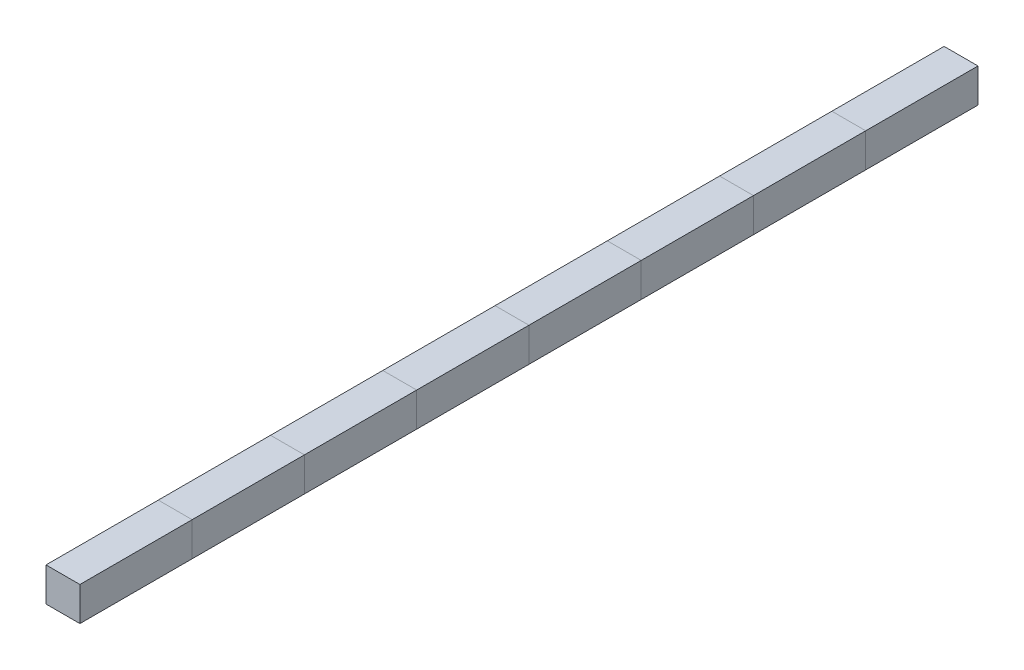
ISO-10303-21;
HEADER;
FILE_DESCRIPTION(('STEP AP214'),'2;1');
FILE_NAME('part.step','',(''),(''),'','','');
FILE_SCHEMA(('AUTOMOTIVE_DESIGN { 1 0 10303 214 1 1 1 1 }'));
ENDSEC;
DATA;
#1=APPLICATION_CONTEXT('core data for automotive mechanical design processes');
#2=APPLICATION_PROTOCOL_DEFINITION('international standard','automotive_design',2000,#1);
#3=PRODUCT_CONTEXT('',#1,'mechanical');
#4=PRODUCT('Part','Part','',(#3));
#5=PRODUCT_RELATED_PRODUCT_CATEGORY('part','',(#4));
#6=PRODUCT_DEFINITION_FORMATION('','',#4);
#7=PRODUCT_DEFINITION_CONTEXT('part definition',#1,'design');
#8=PRODUCT_DEFINITION('design','',#6,#7);
#9=PRODUCT_DEFINITION_SHAPE('','',#8);
#10=(LENGTH_UNIT() NAMED_UNIT(*) SI_UNIT(.MILLI.,.METRE.));
#11=(NAMED_UNIT(*) PLANE_ANGLE_UNIT() SI_UNIT($,.RADIAN.));
#12=(NAMED_UNIT(*) SI_UNIT($,.STERADIAN.) SOLID_ANGLE_UNIT());
#13=UNCERTAINTY_MEASURE_WITH_UNIT(LENGTH_MEASURE(1.E-05),#10,'distance_accuracy_value','');
#14=(GEOMETRIC_REPRESENTATION_CONTEXT(3) GLOBAL_UNCERTAINTY_ASSIGNED_CONTEXT((#13)) GLOBAL_UNIT_ASSIGNED_CONTEXT((#10,
#11,#12)) REPRESENTATION_CONTEXT('',''));
#15=CARTESIAN_POINT('',(0.,0.,0.));
#16=DIRECTION('',(0.,0.,1.));
#17=DIRECTION('',(1.,0.,0.));
#18=AXIS2_PLACEMENT_3D('',#15,#16,#17);
#19=CARTESIAN_POINT('',(10.,-10.,-397.5));
#20=DIRECTION('',(-1.,0.,0.));
#21=DIRECTION('',(0.,0.,1.));
#22=AXIS2_PLACEMENT_3D('',#19,#20,#21);
#23=PLANE('',#22);
#24=DIRECTION('',(0.,1.,0.));
#25=VECTOR('',#24,1.);
#26=CARTESIAN_POINT('',(10.,-10.,-463.75));
#27=LINE('',#26,#25);
#28=CARTESIAN_POINT('',(10.,-10.,-463.75));
#29=VERTEX_POINT('',#28);
#30=CARTESIAN_POINT('',(10.,10.,-463.75));
#31=VERTEX_POINT('',#30);
#32=EDGE_CURVE('E109',#29,#31,#27,.T.);
#33=ORIENTED_EDGE('',*,*,#32,.T.);
#34=DIRECTION('',(0.,0.,-1.));
#35=VECTOR('',#34,1.);
#36=CARTESIAN_POINT('',(10.,10.,-397.5));
#37=LINE('',#36,#35);
#38=CARTESIAN_POINT('',(10.,10.,-397.5));
#39=VERTEX_POINT('',#38);
#40=EDGE_CURVE('E12',#39,#31,#37,.T.);
#41=ORIENTED_EDGE('',*,*,#40,.F.);
#42=DIRECTION('',(0.,1.,0.));
#43=VECTOR('',#42,1.);
#44=CARTESIAN_POINT('',(10.,-10.,-397.5));
#45=LINE('',#44,#43);
#46=CARTESIAN_POINT('',(10.,-10.,-397.5));
#47=VERTEX_POINT('',#46);
#48=EDGE_CURVE('E97',#47,#39,#45,.T.);
#49=ORIENTED_EDGE('',*,*,#48,.F.);
#50=DIRECTION('',(0.,0.,-1.));
#51=VECTOR('',#50,1.);
#52=CARTESIAN_POINT('',(10.,-10.,-397.5));
#53=LINE('',#52,#51);
#54=EDGE_CURVE('E105',#47,#29,#53,.T.);
#55=ORIENTED_EDGE('',*,*,#54,.T.);
#56=EDGE_LOOP('',(#33,#41,#49,#55));
#57=FACE_BOUND('',#56,.T.);
#58=ADVANCED_FACE('F46',(#57),#23,.F.);
#59=CARTESIAN_POINT('',(-10.,10.,-397.5));
#60=DIRECTION('',(0.,-1.,0.));
#61=DIRECTION('',(0.,0.,-1.));
#62=AXIS2_PLACEMENT_3D('',#59,#60,#61);
#63=PLANE('',#62);
#64=DIRECTION('',(-1.,0.,0.));
#65=VECTOR('',#64,1.);
#66=CARTESIAN_POINT('',(-10.,10.,-463.75));
#67=LINE('',#66,#65);
#68=CARTESIAN_POINT('',(-10.,10.,-463.75));
#69=VERTEX_POINT('',#68);
#70=EDGE_CURVE('E101',#31,#69,#67,.T.);
#71=ORIENTED_EDGE('',*,*,#70,.T.);
#72=DIRECTION('',(0.,0.,-1.));
#73=VECTOR('',#72,1.);
#74=CARTESIAN_POINT('',(-10.,10.,-397.5));
#75=LINE('',#74,#73);
#76=CARTESIAN_POINT('',(-10.,10.,-397.5));
#77=VERTEX_POINT('',#76);
#78=EDGE_CURVE('E54',#77,#69,#75,.T.);
#79=ORIENTED_EDGE('',*,*,#78,.F.);
#80=DIRECTION('',(-1.,0.,0.));
#81=VECTOR('',#80,1.);
#82=CARTESIAN_POINT('',(-10.,10.,-397.5));
#83=LINE('',#82,#81);
#84=EDGE_CURVE('E92',#39,#77,#83,.T.);
#85=ORIENTED_EDGE('',*,*,#84,.F.);
#86=ORIENTED_EDGE('',*,*,#40,.T.);
#87=EDGE_LOOP('',(#71,#79,#85,#86));
#88=FACE_BOUND('',#87,.T.);
#89=ADVANCED_FACE('F100',(#88),#63,.F.);
#90=CARTESIAN_POINT('',(-10.,-10.,-397.5));
#91=DIRECTION('',(1.,0.,0.));
#92=DIRECTION('',(0.,0.,-1.));
#93=AXIS2_PLACEMENT_3D('',#90,#91,#92);
#94=PLANE('',#93);
#95=DIRECTION('',(0.,-1.,0.));
#96=VECTOR('',#95,1.);
#97=CARTESIAN_POINT('',(-10.,-10.,-463.75));
#98=LINE('',#97,#96);
#99=CARTESIAN_POINT('',(-10.,-10.,-463.75));
#100=VERTEX_POINT('',#99);
#101=EDGE_CURVE('E79',#69,#100,#98,.T.);
#102=ORIENTED_EDGE('',*,*,#101,.T.);
#103=DIRECTION('',(0.,0.,-1.));
#104=VECTOR('',#103,1.);
#105=CARTESIAN_POINT('',(-10.,-10.,-397.5));
#106=LINE('',#105,#104);
#107=CARTESIAN_POINT('',(-10.,-10.,-397.5));
#108=VERTEX_POINT('',#107);
#109=EDGE_CURVE('E102',#108,#100,#106,.T.);
#110=ORIENTED_EDGE('',*,*,#109,.F.);
#111=DIRECTION('',(0.,-1.,0.));
#112=VECTOR('',#111,1.);
#113=CARTESIAN_POINT('',(-10.,-10.,-397.5));
#114=LINE('',#113,#112);
#115=EDGE_CURVE('E95',#77,#108,#114,.T.);
#116=ORIENTED_EDGE('',*,*,#115,.F.);
#117=ORIENTED_EDGE('',*,*,#78,.T.);
#118=EDGE_LOOP('',(#102,#110,#116,#117));
#119=FACE_BOUND('',#118,.T.);
#120=ADVANCED_FACE('F103',(#119),#94,.F.);
#121=CARTESIAN_POINT('',(-10.,-10.,-397.5));
#122=DIRECTION('',(0.,1.,0.));
#123=DIRECTION('',(0.,0.,1.));
#124=AXIS2_PLACEMENT_3D('',#121,#122,#123);
#125=PLANE('',#124);
#126=DIRECTION('',(1.,0.,0.));
#127=VECTOR('',#126,1.);
#128=CARTESIAN_POINT('',(-10.,-10.,-463.75));
#129=LINE('',#128,#127);
#130=EDGE_CURVE('E85',#100,#29,#129,.T.);
#131=ORIENTED_EDGE('',*,*,#130,.T.);
#132=ORIENTED_EDGE('',*,*,#54,.F.);
#133=DIRECTION('',(1.,0.,0.));
#134=VECTOR('',#133,1.);
#135=CARTESIAN_POINT('',(-10.,-10.,-397.5));
#136=LINE('',#135,#134);
#137=EDGE_CURVE('E62',#108,#47,#136,.T.);
#138=ORIENTED_EDGE('',*,*,#137,.F.);
#139=ORIENTED_EDGE('',*,*,#109,.T.);
#140=EDGE_LOOP('',(#131,#132,#138,#139));
#141=FACE_BOUND('',#140,.T.);
#142=ADVANCED_FACE('F116',(#141),#125,.F.);
#143=CARTESIAN_POINT('',(0.,0.,-397.5));
#144=DIRECTION('',(0.,0.,-1.));
#145=DIRECTION('',(-1.,0.,0.));
#146=AXIS2_PLACEMENT_3D('',#143,#144,#145);
#147=PLANE('',#146);
#148=ORIENTED_EDGE('',*,*,#48,.T.);
#149=ORIENTED_EDGE('',*,*,#84,.T.);
#150=ORIENTED_EDGE('',*,*,#115,.T.);
#151=ORIENTED_EDGE('',*,*,#137,.T.);
#152=EDGE_LOOP('',(#148,#149,#150,#151));
#153=FACE_BOUND('',#152,.T.);
#154=ADVANCED_FACE('F93',(#153),#147,.F.);
#155=CARTESIAN_POINT('',(0.,0.,-463.75));
#156=DIRECTION('',(0.,0.,-1.));
#157=DIRECTION('',(-1.,0.,0.));
#158=AXIS2_PLACEMENT_3D('',#155,#156,#157);
#159=PLANE('',#158);
#160=ORIENTED_EDGE('',*,*,#32,.F.);
#161=ORIENTED_EDGE('',*,*,#130,.F.);
#162=ORIENTED_EDGE('',*,*,#101,.F.);
#163=ORIENTED_EDGE('',*,*,#70,.F.);
#164=EDGE_LOOP('',(#160,#161,#162,#163));
#165=FACE_BOUND('',#164,.T.);
#166=ADVANCED_FACE('F119',(#165),#159,.T.);
#167=CLOSED_SHELL('',(#58,#89,#120,#142,#154,#166));
#168=MANIFOLD_SOLID_BREP('B2',#167);
#169=CARTESIAN_POINT('',(10.,-10.,-331.25));
#170=DIRECTION('',(-1.,0.,0.));
#171=DIRECTION('',(0.,0.,1.));
#172=AXIS2_PLACEMENT_3D('',#169,#170,#171);
#173=PLANE('',#172);
#174=DIRECTION('',(0.,1.,0.));
#175=VECTOR('',#174,1.);
#176=CARTESIAN_POINT('',(10.,-10.,-397.5));
#177=LINE('',#176,#175);
#178=CARTESIAN_POINT('',(10.,-10.,-397.5));
#179=VERTEX_POINT('',#178);
#180=CARTESIAN_POINT('',(10.,10.,-397.5));
#181=VERTEX_POINT('',#180);
#182=EDGE_CURVE('E255',#179,#181,#177,.T.);
#183=ORIENTED_EDGE('',*,*,#182,.T.);
#184=DIRECTION('',(0.,0.,-1.));
#185=VECTOR('',#184,1.);
#186=CARTESIAN_POINT('',(10.,10.,-331.25));
#187=LINE('',#186,#185);
#188=CARTESIAN_POINT('',(10.,10.,-331.25));
#189=VERTEX_POINT('',#188);
#190=EDGE_CURVE('E44',#189,#181,#187,.T.);
#191=ORIENTED_EDGE('',*,*,#190,.F.);
#192=DIRECTION('',(0.,1.,0.));
#193=VECTOR('',#192,1.);
#194=CARTESIAN_POINT('',(10.,-10.,-331.25));
#195=LINE('',#194,#193);
#196=CARTESIAN_POINT('',(10.,-10.,-331.25));
#197=VERTEX_POINT('',#196);
#198=EDGE_CURVE('E243',#197,#189,#195,.T.);
#199=ORIENTED_EDGE('',*,*,#198,.F.);
#200=DIRECTION('',(0.,0.,-1.));
#201=VECTOR('',#200,1.);
#202=CARTESIAN_POINT('',(10.,-10.,-331.25));
#203=LINE('',#202,#201);
#204=EDGE_CURVE('E251',#197,#179,#203,.T.);
#205=ORIENTED_EDGE('',*,*,#204,.T.);
#206=EDGE_LOOP('',(#183,#191,#199,#205));
#207=FACE_BOUND('',#206,.T.);
#208=ADVANCED_FACE('F192',(#207),#173,.F.);
#209=CARTESIAN_POINT('',(-10.,10.,-331.25));
#210=DIRECTION('',(0.,-1.,0.));
#211=DIRECTION('',(0.,0.,-1.));
#212=AXIS2_PLACEMENT_3D('',#209,#210,#211);
#213=PLANE('',#212);
#214=DIRECTION('',(-1.,0.,0.));
#215=VECTOR('',#214,1.);
#216=CARTESIAN_POINT('',(-10.,10.,-397.5));
#217=LINE('',#216,#215);
#218=CARTESIAN_POINT('',(-10.,10.,-397.5));
#219=VERTEX_POINT('',#218);
#220=EDGE_CURVE('E247',#181,#219,#217,.T.);
#221=ORIENTED_EDGE('',*,*,#220,.T.);
#222=DIRECTION('',(0.,0.,-1.));
#223=VECTOR('',#222,1.);
#224=CARTESIAN_POINT('',(-10.,10.,-331.25));
#225=LINE('',#224,#223);
#226=CARTESIAN_POINT('',(-10.,10.,-331.25));
#227=VERTEX_POINT('',#226);
#228=EDGE_CURVE('E200',#227,#219,#225,.T.);
#229=ORIENTED_EDGE('',*,*,#228,.F.);
#230=DIRECTION('',(-1.,0.,0.));
#231=VECTOR('',#230,1.);
#232=CARTESIAN_POINT('',(-10.,10.,-331.25));
#233=LINE('',#232,#231);
#234=EDGE_CURVE('E238',#189,#227,#233,.T.);
#235=ORIENTED_EDGE('',*,*,#234,.F.);
#236=ORIENTED_EDGE('',*,*,#190,.T.);
#237=EDGE_LOOP('',(#221,#229,#235,#236));
#238=FACE_BOUND('',#237,.T.);
#239=ADVANCED_FACE('F246',(#238),#213,.F.);
#240=CARTESIAN_POINT('',(-10.,-10.,-331.25));
#241=DIRECTION('',(1.,0.,0.));
#242=DIRECTION('',(0.,0.,-1.));
#243=AXIS2_PLACEMENT_3D('',#240,#241,#242);
#244=PLANE('',#243);
#245=DIRECTION('',(0.,-1.,0.));
#246=VECTOR('',#245,1.);
#247=CARTESIAN_POINT('',(-10.,-10.,-397.5));
#248=LINE('',#247,#246);
#249=CARTESIAN_POINT('',(-10.,-10.,-397.5));
#250=VERTEX_POINT('',#249);
#251=EDGE_CURVE('E225',#219,#250,#248,.T.);
#252=ORIENTED_EDGE('',*,*,#251,.T.);
#253=DIRECTION('',(0.,0.,-1.));
#254=VECTOR('',#253,1.);
#255=CARTESIAN_POINT('',(-10.,-10.,-331.25));
#256=LINE('',#255,#254);
#257=CARTESIAN_POINT('',(-10.,-10.,-331.25));
#258=VERTEX_POINT('',#257);
#259=EDGE_CURVE('E248',#258,#250,#256,.T.);
#260=ORIENTED_EDGE('',*,*,#259,.F.);
#261=DIRECTION('',(0.,-1.,0.));
#262=VECTOR('',#261,1.);
#263=CARTESIAN_POINT('',(-10.,-10.,-331.25));
#264=LINE('',#263,#262);
#265=EDGE_CURVE('E241',#227,#258,#264,.T.);
#266=ORIENTED_EDGE('',*,*,#265,.F.);
#267=ORIENTED_EDGE('',*,*,#228,.T.);
#268=EDGE_LOOP('',(#252,#260,#266,#267));
#269=FACE_BOUND('',#268,.T.);
#270=ADVANCED_FACE('F249',(#269),#244,.F.);
#271=CARTESIAN_POINT('',(-10.,-10.,-331.25));
#272=DIRECTION('',(0.,1.,0.));
#273=DIRECTION('',(0.,0.,1.));
#274=AXIS2_PLACEMENT_3D('',#271,#272,#273);
#275=PLANE('',#274);
#276=DIRECTION('',(1.,0.,0.));
#277=VECTOR('',#276,1.);
#278=CARTESIAN_POINT('',(-10.,-10.,-397.5));
#279=LINE('',#278,#277);
#280=EDGE_CURVE('E231',#250,#179,#279,.T.);
#281=ORIENTED_EDGE('',*,*,#280,.T.);
#282=ORIENTED_EDGE('',*,*,#204,.F.);
#283=DIRECTION('',(1.,0.,0.));
#284=VECTOR('',#283,1.);
#285=CARTESIAN_POINT('',(-10.,-10.,-331.25));
#286=LINE('',#285,#284);
#287=EDGE_CURVE('E208',#258,#197,#286,.T.);
#288=ORIENTED_EDGE('',*,*,#287,.F.);
#289=ORIENTED_EDGE('',*,*,#259,.T.);
#290=EDGE_LOOP('',(#281,#282,#288,#289));
#291=FACE_BOUND('',#290,.T.);
#292=ADVANCED_FACE('F262',(#291),#275,.F.);
#293=CARTESIAN_POINT('',(0.,0.,-331.25));
#294=DIRECTION('',(0.,0.,-1.));
#295=DIRECTION('',(-1.,0.,0.));
#296=AXIS2_PLACEMENT_3D('',#293,#294,#295);
#297=PLANE('',#296);
#298=ORIENTED_EDGE('',*,*,#198,.T.);
#299=ORIENTED_EDGE('',*,*,#234,.T.);
#300=ORIENTED_EDGE('',*,*,#265,.T.);
#301=ORIENTED_EDGE('',*,*,#287,.T.);
#302=EDGE_LOOP('',(#298,#299,#300,#301));
#303=FACE_BOUND('',#302,.T.);
#304=ADVANCED_FACE('F239',(#303),#297,.F.);
#305=CARTESIAN_POINT('',(0.,0.,-397.5));
#306=DIRECTION('',(0.,0.,-1.));
#307=DIRECTION('',(-1.,0.,0.));
#308=AXIS2_PLACEMENT_3D('',#305,#306,#307);
#309=PLANE('',#308);
#310=ORIENTED_EDGE('',*,*,#182,.F.);
#311=ORIENTED_EDGE('',*,*,#280,.F.);
#312=ORIENTED_EDGE('',*,*,#251,.F.);
#313=ORIENTED_EDGE('',*,*,#220,.F.);
#314=EDGE_LOOP('',(#310,#311,#312,#313));
#315=FACE_BOUND('',#314,.T.);
#316=ADVANCED_FACE('F265',(#315),#309,.T.);
#317=CLOSED_SHELL('',(#208,#239,#270,#292,#304,#316));
#318=MANIFOLD_SOLID_BREP('B6',#317);
#319=CARTESIAN_POINT('',(10.,-10.,-265.));
#320=DIRECTION('',(-1.,0.,0.));
#321=DIRECTION('',(0.,0.,1.));
#322=AXIS2_PLACEMENT_3D('',#319,#320,#321);
#323=PLANE('',#322);
#324=DIRECTION('',(0.,1.,0.));
#325=VECTOR('',#324,1.);
#326=CARTESIAN_POINT('',(10.,-10.,-331.25));
#327=LINE('',#326,#325);
#328=CARTESIAN_POINT('',(10.,-10.,-331.25));
#329=VERTEX_POINT('',#328);
#330=CARTESIAN_POINT('',(10.,10.,-331.25));
#331=VERTEX_POINT('',#330);
#332=EDGE_CURVE('E399',#329,#331,#327,.T.);
#333=ORIENTED_EDGE('',*,*,#332,.T.);
#334=DIRECTION('',(0.,0.,-1.));
#335=VECTOR('',#334,1.);
#336=CARTESIAN_POINT('',(10.,10.,-265.));
#337=LINE('',#336,#335);
#338=CARTESIAN_POINT('',(10.,10.,-265.));
#339=VERTEX_POINT('',#338);
#340=EDGE_CURVE('E190',#339,#331,#337,.T.);
#341=ORIENTED_EDGE('',*,*,#340,.F.);
#342=DIRECTION('',(0.,1.,0.));
#343=VECTOR('',#342,1.);
#344=CARTESIAN_POINT('',(10.,-10.,-265.));
#345=LINE('',#344,#343);
#346=CARTESIAN_POINT('',(10.,-10.,-265.));
#347=VERTEX_POINT('',#346);
#348=EDGE_CURVE('E387',#347,#339,#345,.T.);
#349=ORIENTED_EDGE('',*,*,#348,.F.);
#350=DIRECTION('',(0.,0.,-1.));
#351=VECTOR('',#350,1.);
#352=CARTESIAN_POINT('',(10.,-10.,-265.));
#353=LINE('',#352,#351);
#354=EDGE_CURVE('E395',#347,#329,#353,.T.);
#355=ORIENTED_EDGE('',*,*,#354,.T.);
#356=EDGE_LOOP('',(#333,#341,#349,#355));
#357=FACE_BOUND('',#356,.T.);
#358=ADVANCED_FACE('F336',(#357),#323,.F.);
#359=CARTESIAN_POINT('',(-10.,10.,-265.));
#360=DIRECTION('',(0.,-1.,0.));
#361=DIRECTION('',(0.,0.,-1.));
#362=AXIS2_PLACEMENT_3D('',#359,#360,#361);
#363=PLANE('',#362);
#364=DIRECTION('',(-1.,0.,0.));
#365=VECTOR('',#364,1.);
#366=CARTESIAN_POINT('',(-10.,10.,-331.25));
#367=LINE('',#366,#365);
#368=CARTESIAN_POINT('',(-10.,10.,-331.25));
#369=VERTEX_POINT('',#368);
#370=EDGE_CURVE('E391',#331,#369,#367,.T.);
#371=ORIENTED_EDGE('',*,*,#370,.T.);
#372=DIRECTION('',(0.,0.,-1.));
#373=VECTOR('',#372,1.);
#374=CARTESIAN_POINT('',(-10.,10.,-265.));
#375=LINE('',#374,#373);
#376=CARTESIAN_POINT('',(-10.,10.,-265.));
#377=VERTEX_POINT('',#376);
#378=EDGE_CURVE('E344',#377,#369,#375,.T.);
#379=ORIENTED_EDGE('',*,*,#378,.F.);
#380=DIRECTION('',(-1.,0.,0.));
#381=VECTOR('',#380,1.);
#382=CARTESIAN_POINT('',(-10.,10.,-265.));
#383=LINE('',#382,#381);
#384=EDGE_CURVE('E382',#339,#377,#383,.T.);
#385=ORIENTED_EDGE('',*,*,#384,.F.);
#386=ORIENTED_EDGE('',*,*,#340,.T.);
#387=EDGE_LOOP('',(#371,#379,#385,#386));
#388=FACE_BOUND('',#387,.T.);
#389=ADVANCED_FACE('F390',(#388),#363,.F.);
#390=CARTESIAN_POINT('',(-10.,-10.,-265.));
#391=DIRECTION('',(1.,0.,0.));
#392=DIRECTION('',(0.,0.,-1.));
#393=AXIS2_PLACEMENT_3D('',#390,#391,#392);
#394=PLANE('',#393);
#395=DIRECTION('',(0.,-1.,0.));
#396=VECTOR('',#395,1.);
#397=CARTESIAN_POINT('',(-10.,-10.,-331.25));
#398=LINE('',#397,#396);
#399=CARTESIAN_POINT('',(-10.,-10.,-331.25));
#400=VERTEX_POINT('',#399);
#401=EDGE_CURVE('E369',#369,#400,#398,.T.);
#402=ORIENTED_EDGE('',*,*,#401,.T.);
#403=DIRECTION('',(0.,0.,-1.));
#404=VECTOR('',#403,1.);
#405=CARTESIAN_POINT('',(-10.,-10.,-265.));
#406=LINE('',#405,#404);
#407=CARTESIAN_POINT('',(-10.,-10.,-265.));
#408=VERTEX_POINT('',#407);
#409=EDGE_CURVE('E392',#408,#400,#406,.T.);
#410=ORIENTED_EDGE('',*,*,#409,.F.);
#411=DIRECTION('',(0.,-1.,0.));
#412=VECTOR('',#411,1.);
#413=CARTESIAN_POINT('',(-10.,-10.,-265.));
#414=LINE('',#413,#412);
#415=EDGE_CURVE('E385',#377,#408,#414,.T.);
#416=ORIENTED_EDGE('',*,*,#415,.F.);
#417=ORIENTED_EDGE('',*,*,#378,.T.);
#418=EDGE_LOOP('',(#402,#410,#416,#417));
#419=FACE_BOUND('',#418,.T.);
#420=ADVANCED_FACE('F393',(#419),#394,.F.);
#421=CARTESIAN_POINT('',(-10.,-10.,-265.));
#422=DIRECTION('',(0.,1.,0.));
#423=DIRECTION('',(0.,0.,1.));
#424=AXIS2_PLACEMENT_3D('',#421,#422,#423);
#425=PLANE('',#424);
#426=DIRECTION('',(1.,0.,0.));
#427=VECTOR('',#426,1.);
#428=CARTESIAN_POINT('',(-10.,-10.,-331.25));
#429=LINE('',#428,#427);
#430=EDGE_CURVE('E375',#400,#329,#429,.T.);
#431=ORIENTED_EDGE('',*,*,#430,.T.);
#432=ORIENTED_EDGE('',*,*,#354,.F.);
#433=DIRECTION('',(1.,0.,0.));
#434=VECTOR('',#433,1.);
#435=CARTESIAN_POINT('',(-10.,-10.,-265.));
#436=LINE('',#435,#434);
#437=EDGE_CURVE('E352',#408,#347,#436,.T.);
#438=ORIENTED_EDGE('',*,*,#437,.F.);
#439=ORIENTED_EDGE('',*,*,#409,.T.);
#440=EDGE_LOOP('',(#431,#432,#438,#439));
#441=FACE_BOUND('',#440,.T.);
#442=ADVANCED_FACE('F406',(#441),#425,.F.);
#443=CARTESIAN_POINT('',(0.,0.,-265.));
#444=DIRECTION('',(0.,0.,-1.));
#445=DIRECTION('',(-1.,0.,0.));
#446=AXIS2_PLACEMENT_3D('',#443,#444,#445);
#447=PLANE('',#446);
#448=ORIENTED_EDGE('',*,*,#348,.T.);
#449=ORIENTED_EDGE('',*,*,#384,.T.);
#450=ORIENTED_EDGE('',*,*,#415,.T.);
#451=ORIENTED_EDGE('',*,*,#437,.T.);
#452=EDGE_LOOP('',(#448,#449,#450,#451));
#453=FACE_BOUND('',#452,.T.);
#454=ADVANCED_FACE('F383',(#453),#447,.F.);
#455=CARTESIAN_POINT('',(0.,0.,-331.25));
#456=DIRECTION('',(0.,0.,-1.));
#457=DIRECTION('',(-1.,0.,0.));
#458=AXIS2_PLACEMENT_3D('',#455,#456,#457);
#459=PLANE('',#458);
#460=ORIENTED_EDGE('',*,*,#332,.F.);
#461=ORIENTED_EDGE('',*,*,#430,.F.);
#462=ORIENTED_EDGE('',*,*,#401,.F.);
#463=ORIENTED_EDGE('',*,*,#370,.F.);
#464=EDGE_LOOP('',(#460,#461,#462,#463));
#465=FACE_BOUND('',#464,.T.);
#466=ADVANCED_FACE('F409',(#465),#459,.T.);
#467=CLOSED_SHELL('',(#358,#389,#420,#442,#454,#466));
#468=MANIFOLD_SOLID_BREP('B38',#467);
#469=CARTESIAN_POINT('',(10.,-10.,-198.75));
#470=DIRECTION('',(-1.,0.,0.));
#471=DIRECTION('',(0.,0.,1.));
#472=AXIS2_PLACEMENT_3D('',#469,#470,#471);
#473=PLANE('',#472);
#474=DIRECTION('',(0.,1.,0.));
#475=VECTOR('',#474,1.);
#476=CARTESIAN_POINT('',(10.,-10.,-265.));
#477=LINE('',#476,#475);
#478=CARTESIAN_POINT('',(10.,-10.,-265.));
#479=VERTEX_POINT('',#478);
#480=CARTESIAN_POINT('',(10.,10.,-265.));
#481=VERTEX_POINT('',#480);
#482=EDGE_CURVE('E543',#479,#481,#477,.T.);
#483=ORIENTED_EDGE('',*,*,#482,.T.);
#484=DIRECTION('',(0.,0.,-1.));
#485=VECTOR('',#484,1.);
#486=CARTESIAN_POINT('',(10.,10.,-198.75));
#487=LINE('',#486,#485);
#488=CARTESIAN_POINT('',(10.,10.,-198.75));
#489=VERTEX_POINT('',#488);
#490=EDGE_CURVE('E334',#489,#481,#487,.T.);
#491=ORIENTED_EDGE('',*,*,#490,.F.);
#492=DIRECTION('',(0.,1.,0.));
#493=VECTOR('',#492,1.);
#494=CARTESIAN_POINT('',(10.,-10.,-198.75));
#495=LINE('',#494,#493);
#496=CARTESIAN_POINT('',(10.,-10.,-198.75));
#497=VERTEX_POINT('',#496);
#498=EDGE_CURVE('E531',#497,#489,#495,.T.);
#499=ORIENTED_EDGE('',*,*,#498,.F.);
#500=DIRECTION('',(0.,0.,-1.));
#501=VECTOR('',#500,1.);
#502=CARTESIAN_POINT('',(10.,-10.,-198.75));
#503=LINE('',#502,#501);
#504=EDGE_CURVE('E539',#497,#479,#503,.T.);
#505=ORIENTED_EDGE('',*,*,#504,.T.);
#506=EDGE_LOOP('',(#483,#491,#499,#505));
#507=FACE_BOUND('',#506,.T.);
#508=ADVANCED_FACE('F480',(#507),#473,.F.);
#509=CARTESIAN_POINT('',(-10.,10.,-198.75));
#510=DIRECTION('',(0.,-1.,0.));
#511=DIRECTION('',(0.,0.,-1.));
#512=AXIS2_PLACEMENT_3D('',#509,#510,#511);
#513=PLANE('',#512);
#514=DIRECTION('',(-1.,0.,0.));
#515=VECTOR('',#514,1.);
#516=CARTESIAN_POINT('',(-10.,10.,-265.));
#517=LINE('',#516,#515);
#518=CARTESIAN_POINT('',(-10.,10.,-265.));
#519=VERTEX_POINT('',#518);
#520=EDGE_CURVE('E535',#481,#519,#517,.T.);
#521=ORIENTED_EDGE('',*,*,#520,.T.);
#522=DIRECTION('',(0.,0.,-1.));
#523=VECTOR('',#522,1.);
#524=CARTESIAN_POINT('',(-10.,10.,-198.75));
#525=LINE('',#524,#523);
#526=CARTESIAN_POINT('',(-10.,10.,-198.75));
#527=VERTEX_POINT('',#526);
#528=EDGE_CURVE('E488',#527,#519,#525,.T.);
#529=ORIENTED_EDGE('',*,*,#528,.F.);
#530=DIRECTION('',(-1.,0.,0.));
#531=VECTOR('',#530,1.);
#532=CARTESIAN_POINT('',(-10.,10.,-198.75));
#533=LINE('',#532,#531);
#534=EDGE_CURVE('E526',#489,#527,#533,.T.);
#535=ORIENTED_EDGE('',*,*,#534,.F.);
#536=ORIENTED_EDGE('',*,*,#490,.T.);
#537=EDGE_LOOP('',(#521,#529,#535,#536));
#538=FACE_BOUND('',#537,.T.);
#539=ADVANCED_FACE('F534',(#538),#513,.F.);
#540=CARTESIAN_POINT('',(-10.,-10.,-198.75));
#541=DIRECTION('',(1.,0.,0.));
#542=DIRECTION('',(0.,0.,-1.));
#543=AXIS2_PLACEMENT_3D('',#540,#541,#542);
#544=PLANE('',#543);
#545=DIRECTION('',(0.,-1.,0.));
#546=VECTOR('',#545,1.);
#547=CARTESIAN_POINT('',(-10.,-10.,-265.));
#548=LINE('',#547,#546);
#549=CARTESIAN_POINT('',(-10.,-10.,-265.));
#550=VERTEX_POINT('',#549);
#551=EDGE_CURVE('E513',#519,#550,#548,.T.);
#552=ORIENTED_EDGE('',*,*,#551,.T.);
#553=DIRECTION('',(0.,0.,-1.));
#554=VECTOR('',#553,1.);
#555=CARTESIAN_POINT('',(-10.,-10.,-198.75));
#556=LINE('',#555,#554);
#557=CARTESIAN_POINT('',(-10.,-10.,-198.75));
#558=VERTEX_POINT('',#557);
#559=EDGE_CURVE('E536',#558,#550,#556,.T.);
#560=ORIENTED_EDGE('',*,*,#559,.F.);
#561=DIRECTION('',(0.,-1.,0.));
#562=VECTOR('',#561,1.);
#563=CARTESIAN_POINT('',(-10.,-10.,-198.75));
#564=LINE('',#563,#562);
#565=EDGE_CURVE('E529',#527,#558,#564,.T.);
#566=ORIENTED_EDGE('',*,*,#565,.F.);
#567=ORIENTED_EDGE('',*,*,#528,.T.);
#568=EDGE_LOOP('',(#552,#560,#566,#567));
#569=FACE_BOUND('',#568,.T.);
#570=ADVANCED_FACE('F537',(#569),#544,.F.);
#571=CARTESIAN_POINT('',(-10.,-10.,-198.75));
#572=DIRECTION('',(0.,1.,0.));
#573=DIRECTION('',(0.,0.,1.));
#574=AXIS2_PLACEMENT_3D('',#571,#572,#573);
#575=PLANE('',#574);
#576=DIRECTION('',(1.,0.,0.));
#577=VECTOR('',#576,1.);
#578=CARTESIAN_POINT('',(-10.,-10.,-265.));
#579=LINE('',#578,#577);
#580=EDGE_CURVE('E519',#550,#479,#579,.T.);
#581=ORIENTED_EDGE('',*,*,#580,.T.);
#582=ORIENTED_EDGE('',*,*,#504,.F.);
#583=DIRECTION('',(1.,0.,0.));
#584=VECTOR('',#583,1.);
#585=CARTESIAN_POINT('',(-10.,-10.,-198.75));
#586=LINE('',#585,#584);
#587=EDGE_CURVE('E496',#558,#497,#586,.T.);
#588=ORIENTED_EDGE('',*,*,#587,.F.);
#589=ORIENTED_EDGE('',*,*,#559,.T.);
#590=EDGE_LOOP('',(#581,#582,#588,#589));
#591=FACE_BOUND('',#590,.T.);
#592=ADVANCED_FACE('F550',(#591),#575,.F.);
#593=CARTESIAN_POINT('',(0.,0.,-198.75));
#594=DIRECTION('',(0.,0.,-1.));
#595=DIRECTION('',(-1.,0.,0.));
#596=AXIS2_PLACEMENT_3D('',#593,#594,#595);
#597=PLANE('',#596);
#598=ORIENTED_EDGE('',*,*,#498,.T.);
#599=ORIENTED_EDGE('',*,*,#534,.T.);
#600=ORIENTED_EDGE('',*,*,#565,.T.);
#601=ORIENTED_EDGE('',*,*,#587,.T.);
#602=EDGE_LOOP('',(#598,#599,#600,#601));
#603=FACE_BOUND('',#602,.T.);
#604=ADVANCED_FACE('F527',(#603),#597,.F.);
#605=CARTESIAN_POINT('',(0.,0.,-265.));
#606=DIRECTION('',(0.,0.,-1.));
#607=DIRECTION('',(-1.,0.,0.));
#608=AXIS2_PLACEMENT_3D('',#605,#606,#607);
#609=PLANE('',#608);
#610=ORIENTED_EDGE('',*,*,#482,.F.);
#611=ORIENTED_EDGE('',*,*,#580,.F.);
#612=ORIENTED_EDGE('',*,*,#551,.F.);
#613=ORIENTED_EDGE('',*,*,#520,.F.);
#614=EDGE_LOOP('',(#610,#611,#612,#613));
#615=FACE_BOUND('',#614,.T.);
#616=ADVANCED_FACE('F553',(#615),#609,.T.);
#617=CLOSED_SHELL('',(#508,#539,#570,#592,#604,#616));
#618=MANIFOLD_SOLID_BREP('B184',#617);
#619=CARTESIAN_POINT('',(10.,-10.,-132.5));
#620=DIRECTION('',(-1.,0.,0.));
#621=DIRECTION('',(0.,0.,1.));
#622=AXIS2_PLACEMENT_3D('',#619,#620,#621);
#623=PLANE('',#622);
#624=DIRECTION('',(0.,1.,0.));
#625=VECTOR('',#624,1.);
#626=CARTESIAN_POINT('',(10.,-10.,-198.75));
#627=LINE('',#626,#625);
#628=CARTESIAN_POINT('',(10.,-10.,-198.75));
#629=VERTEX_POINT('',#628);
#630=CARTESIAN_POINT('',(10.,10.,-198.75));
#631=VERTEX_POINT('',#630);
#632=EDGE_CURVE('E687',#629,#631,#627,.T.);
#633=ORIENTED_EDGE('',*,*,#632,.T.);
#634=DIRECTION('',(0.,0.,-1.));
#635=VECTOR('',#634,1.);
#636=CARTESIAN_POINT('',(10.,10.,-132.5));
#637=LINE('',#636,#635);
#638=CARTESIAN_POINT('',(10.,10.,-132.5));
#639=VERTEX_POINT('',#638);
#640=EDGE_CURVE('E478',#639,#631,#637,.T.);
#641=ORIENTED_EDGE('',*,*,#640,.F.);
#642=DIRECTION('',(0.,1.,0.));
#643=VECTOR('',#642,1.);
#644=CARTESIAN_POINT('',(10.,-10.,-132.5));
#645=LINE('',#644,#643);
#646=CARTESIAN_POINT('',(10.,-10.,-132.5));
#647=VERTEX_POINT('',#646);
#648=EDGE_CURVE('E675',#647,#639,#645,.T.);
#649=ORIENTED_EDGE('',*,*,#648,.F.);
#650=DIRECTION('',(0.,0.,-1.));
#651=VECTOR('',#650,1.);
#652=CARTESIAN_POINT('',(10.,-10.,-132.5));
#653=LINE('',#652,#651);
#654=EDGE_CURVE('E683',#647,#629,#653,.T.);
#655=ORIENTED_EDGE('',*,*,#654,.T.);
#656=EDGE_LOOP('',(#633,#641,#649,#655));
#657=FACE_BOUND('',#656,.T.);
#658=ADVANCED_FACE('F624',(#657),#623,.F.);
#659=CARTESIAN_POINT('',(-10.,10.,-132.5));
#660=DIRECTION('',(0.,-1.,0.));
#661=DIRECTION('',(0.,0.,-1.));
#662=AXIS2_PLACEMENT_3D('',#659,#660,#661);
#663=PLANE('',#662);
#664=DIRECTION('',(-1.,0.,0.));
#665=VECTOR('',#664,1.);
#666=CARTESIAN_POINT('',(-10.,10.,-198.75));
#667=LINE('',#666,#665);
#668=CARTESIAN_POINT('',(-10.,10.,-198.75));
#669=VERTEX_POINT('',#668);
#670=EDGE_CURVE('E679',#631,#669,#667,.T.);
#671=ORIENTED_EDGE('',*,*,#670,.T.);
#672=DIRECTION('',(0.,0.,-1.));
#673=VECTOR('',#672,1.);
#674=CARTESIAN_POINT('',(-10.,10.,-132.5));
#675=LINE('',#674,#673);
#676=CARTESIAN_POINT('',(-10.,10.,-132.5));
#677=VERTEX_POINT('',#676);
#678=EDGE_CURVE('E632',#677,#669,#675,.T.);
#679=ORIENTED_EDGE('',*,*,#678,.F.);
#680=DIRECTION('',(-1.,0.,0.));
#681=VECTOR('',#680,1.);
#682=CARTESIAN_POINT('',(-10.,10.,-132.5));
#683=LINE('',#682,#681);
#684=EDGE_CURVE('E670',#639,#677,#683,.T.);
#685=ORIENTED_EDGE('',*,*,#684,.F.);
#686=ORIENTED_EDGE('',*,*,#640,.T.);
#687=EDGE_LOOP('',(#671,#679,#685,#686));
#688=FACE_BOUND('',#687,.T.);
#689=ADVANCED_FACE('F678',(#688),#663,.F.);
#690=CARTESIAN_POINT('',(-10.,-10.,-132.5));
#691=DIRECTION('',(1.,0.,0.));
#692=DIRECTION('',(0.,0.,-1.));
#693=AXIS2_PLACEMENT_3D('',#690,#691,#692);
#694=PLANE('',#693);
#695=DIRECTION('',(0.,-1.,0.));
#696=VECTOR('',#695,1.);
#697=CARTESIAN_POINT('',(-10.,-10.,-198.75));
#698=LINE('',#697,#696);
#699=CARTESIAN_POINT('',(-10.,-10.,-198.75));
#700=VERTEX_POINT('',#699);
#701=EDGE_CURVE('E657',#669,#700,#698,.T.);
#702=ORIENTED_EDGE('',*,*,#701,.T.);
#703=DIRECTION('',(0.,0.,-1.));
#704=VECTOR('',#703,1.);
#705=CARTESIAN_POINT('',(-10.,-10.,-132.5));
#706=LINE('',#705,#704);
#707=CARTESIAN_POINT('',(-10.,-10.,-132.5));
#708=VERTEX_POINT('',#707);
#709=EDGE_CURVE('E680',#708,#700,#706,.T.);
#710=ORIENTED_EDGE('',*,*,#709,.F.);
#711=DIRECTION('',(0.,-1.,0.));
#712=VECTOR('',#711,1.);
#713=CARTESIAN_POINT('',(-10.,-10.,-132.5));
#714=LINE('',#713,#712);
#715=EDGE_CURVE('E673',#677,#708,#714,.T.);
#716=ORIENTED_EDGE('',*,*,#715,.F.);
#717=ORIENTED_EDGE('',*,*,#678,.T.);
#718=EDGE_LOOP('',(#702,#710,#716,#717));
#719=FACE_BOUND('',#718,.T.);
#720=ADVANCED_FACE('F681',(#719),#694,.F.);
#721=CARTESIAN_POINT('',(-10.,-10.,-132.5));
#722=DIRECTION('',(0.,1.,0.));
#723=DIRECTION('',(0.,0.,1.));
#724=AXIS2_PLACEMENT_3D('',#721,#722,#723);
#725=PLANE('',#724);
#726=DIRECTION('',(1.,0.,0.));
#727=VECTOR('',#726,1.);
#728=CARTESIAN_POINT('',(-10.,-10.,-198.75));
#729=LINE('',#728,#727);
#730=EDGE_CURVE('E663',#700,#629,#729,.T.);
#731=ORIENTED_EDGE('',*,*,#730,.T.);
#732=ORIENTED_EDGE('',*,*,#654,.F.);
#733=DIRECTION('',(1.,0.,0.));
#734=VECTOR('',#733,1.);
#735=CARTESIAN_POINT('',(-10.,-10.,-132.5));
#736=LINE('',#735,#734);
#737=EDGE_CURVE('E640',#708,#647,#736,.T.);
#738=ORIENTED_EDGE('',*,*,#737,.F.);
#739=ORIENTED_EDGE('',*,*,#709,.T.);
#740=EDGE_LOOP('',(#731,#732,#738,#739));
#741=FACE_BOUND('',#740,.T.);
#742=ADVANCED_FACE('F694',(#741),#725,.F.);
#743=CARTESIAN_POINT('',(0.,0.,-132.5));
#744=DIRECTION('',(0.,0.,-1.));
#745=DIRECTION('',(-1.,0.,0.));
#746=AXIS2_PLACEMENT_3D('',#743,#744,#745);
#747=PLANE('',#746);
#748=ORIENTED_EDGE('',*,*,#648,.T.);
#749=ORIENTED_EDGE('',*,*,#684,.T.);
#750=ORIENTED_EDGE('',*,*,#715,.T.);
#751=ORIENTED_EDGE('',*,*,#737,.T.);
#752=EDGE_LOOP('',(#748,#749,#750,#751));
#753=FACE_BOUND('',#752,.T.);
#754=ADVANCED_FACE('F671',(#753),#747,.F.);
#755=CARTESIAN_POINT('',(0.,0.,-198.75));
#756=DIRECTION('',(0.,0.,-1.));
#757=DIRECTION('',(-1.,0.,0.));
#758=AXIS2_PLACEMENT_3D('',#755,#756,#757);
#759=PLANE('',#758);
#760=ORIENTED_EDGE('',*,*,#632,.F.);
#761=ORIENTED_EDGE('',*,*,#730,.F.);
#762=ORIENTED_EDGE('',*,*,#701,.F.);
#763=ORIENTED_EDGE('',*,*,#670,.F.);
#764=EDGE_LOOP('',(#760,#761,#762,#763));
#765=FACE_BOUND('',#764,.T.);
#766=ADVANCED_FACE('F697',(#765),#759,.T.);
#767=CLOSED_SHELL('',(#658,#689,#720,#742,#754,#766));
#768=MANIFOLD_SOLID_BREP('B328',#767);
#769=CARTESIAN_POINT('',(10.,-10.,-66.25));
#770=DIRECTION('',(-1.,0.,0.));
#771=DIRECTION('',(0.,0.,1.));
#772=AXIS2_PLACEMENT_3D('',#769,#770,#771);
#773=PLANE('',#772);
#774=DIRECTION('',(0.,1.,0.));
#775=VECTOR('',#774,1.);
#776=CARTESIAN_POINT('',(10.,-10.,-132.5));
#777=LINE('',#776,#775);
#778=CARTESIAN_POINT('',(10.,-10.,-132.5));
#779=VERTEX_POINT('',#778);
#780=CARTESIAN_POINT('',(10.,10.,-132.5));
#781=VERTEX_POINT('',#780);
#782=EDGE_CURVE('E831',#779,#781,#777,.T.);
#783=ORIENTED_EDGE('',*,*,#782,.T.);
#784=DIRECTION('',(0.,0.,-1.));
#785=VECTOR('',#784,1.);
#786=CARTESIAN_POINT('',(10.,10.,-66.25));
#787=LINE('',#786,#785);
#788=CARTESIAN_POINT('',(10.,10.,-66.25));
#789=VERTEX_POINT('',#788);
#790=EDGE_CURVE('E622',#789,#781,#787,.T.);
#791=ORIENTED_EDGE('',*,*,#790,.F.);
#792=DIRECTION('',(0.,1.,0.));
#793=VECTOR('',#792,1.);
#794=CARTESIAN_POINT('',(10.,-10.,-66.25));
#795=LINE('',#794,#793);
#796=CARTESIAN_POINT('',(10.,-10.,-66.25));
#797=VERTEX_POINT('',#796);
#798=EDGE_CURVE('E819',#797,#789,#795,.T.);
#799=ORIENTED_EDGE('',*,*,#798,.F.);
#800=DIRECTION('',(0.,0.,-1.));
#801=VECTOR('',#800,1.);
#802=CARTESIAN_POINT('',(10.,-10.,-66.25));
#803=LINE('',#802,#801);
#804=EDGE_CURVE('E827',#797,#779,#803,.T.);
#805=ORIENTED_EDGE('',*,*,#804,.T.);
#806=EDGE_LOOP('',(#783,#791,#799,#805));
#807=FACE_BOUND('',#806,.T.);
#808=ADVANCED_FACE('F768',(#807),#773,.F.);
#809=CARTESIAN_POINT('',(-10.,10.,-66.25));
#810=DIRECTION('',(0.,-1.,0.));
#811=DIRECTION('',(0.,0.,-1.));
#812=AXIS2_PLACEMENT_3D('',#809,#810,#811);
#813=PLANE('',#812);
#814=DIRECTION('',(-1.,0.,0.));
#815=VECTOR('',#814,1.);
#816=CARTESIAN_POINT('',(-10.,10.,-132.5));
#817=LINE('',#816,#815);
#818=CARTESIAN_POINT('',(-10.,10.,-132.5));
#819=VERTEX_POINT('',#818);
#820=EDGE_CURVE('E823',#781,#819,#817,.T.);
#821=ORIENTED_EDGE('',*,*,#820,.T.);
#822=DIRECTION('',(0.,0.,-1.));
#823=VECTOR('',#822,1.);
#824=CARTESIAN_POINT('',(-10.,10.,-66.25));
#825=LINE('',#824,#823);
#826=CARTESIAN_POINT('',(-10.,10.,-66.25));
#827=VERTEX_POINT('',#826);
#828=EDGE_CURVE('E776',#827,#819,#825,.T.);
#829=ORIENTED_EDGE('',*,*,#828,.F.);
#830=DIRECTION('',(-1.,0.,0.));
#831=VECTOR('',#830,1.);
#832=CARTESIAN_POINT('',(-10.,10.,-66.25));
#833=LINE('',#832,#831);
#834=EDGE_CURVE('E814',#789,#827,#833,.T.);
#835=ORIENTED_EDGE('',*,*,#834,.F.);
#836=ORIENTED_EDGE('',*,*,#790,.T.);
#837=EDGE_LOOP('',(#821,#829,#835,#836));
#838=FACE_BOUND('',#837,.T.);
#839=ADVANCED_FACE('F822',(#838),#813,.F.);
#840=CARTESIAN_POINT('',(-10.,-10.,-66.25));
#841=DIRECTION('',(1.,0.,0.));
#842=DIRECTION('',(0.,0.,-1.));
#843=AXIS2_PLACEMENT_3D('',#840,#841,#842);
#844=PLANE('',#843);
#845=DIRECTION('',(0.,-1.,0.));
#846=VECTOR('',#845,1.);
#847=CARTESIAN_POINT('',(-10.,-10.,-132.5));
#848=LINE('',#847,#846);
#849=CARTESIAN_POINT('',(-10.,-10.,-132.5));
#850=VERTEX_POINT('',#849);
#851=EDGE_CURVE('E801',#819,#850,#848,.T.);
#852=ORIENTED_EDGE('',*,*,#851,.T.);
#853=DIRECTION('',(0.,0.,-1.));
#854=VECTOR('',#853,1.);
#855=CARTESIAN_POINT('',(-10.,-10.,-66.25));
#856=LINE('',#855,#854);
#857=CARTESIAN_POINT('',(-10.,-10.,-66.25));
#858=VERTEX_POINT('',#857);
#859=EDGE_CURVE('E824',#858,#850,#856,.T.);
#860=ORIENTED_EDGE('',*,*,#859,.F.);
#861=DIRECTION('',(0.,-1.,0.));
#862=VECTOR('',#861,1.);
#863=CARTESIAN_POINT('',(-10.,-10.,-66.25));
#864=LINE('',#863,#862);
#865=EDGE_CURVE('E817',#827,#858,#864,.T.);
#866=ORIENTED_EDGE('',*,*,#865,.F.);
#867=ORIENTED_EDGE('',*,*,#828,.T.);
#868=EDGE_LOOP('',(#852,#860,#866,#867));
#869=FACE_BOUND('',#868,.T.);
#870=ADVANCED_FACE('F825',(#869),#844,.F.);
#871=CARTESIAN_POINT('',(-10.,-10.,-66.25));
#872=DIRECTION('',(0.,1.,0.));
#873=DIRECTION('',(0.,0.,1.));
#874=AXIS2_PLACEMENT_3D('',#871,#872,#873);
#875=PLANE('',#874);
#876=DIRECTION('',(1.,0.,0.));
#877=VECTOR('',#876,1.);
#878=CARTESIAN_POINT('',(-10.,-10.,-132.5));
#879=LINE('',#878,#877);
#880=EDGE_CURVE('E807',#850,#779,#879,.T.);
#881=ORIENTED_EDGE('',*,*,#880,.T.);
#882=ORIENTED_EDGE('',*,*,#804,.F.);
#883=DIRECTION('',(1.,0.,0.));
#884=VECTOR('',#883,1.);
#885=CARTESIAN_POINT('',(-10.,-10.,-66.25));
#886=LINE('',#885,#884);
#887=EDGE_CURVE('E784',#858,#797,#886,.T.);
#888=ORIENTED_EDGE('',*,*,#887,.F.);
#889=ORIENTED_EDGE('',*,*,#859,.T.);
#890=EDGE_LOOP('',(#881,#882,#888,#889));
#891=FACE_BOUND('',#890,.T.);
#892=ADVANCED_FACE('F838',(#891),#875,.F.);
#893=CARTESIAN_POINT('',(0.,0.,-66.25));
#894=DIRECTION('',(0.,0.,-1.));
#895=DIRECTION('',(-1.,0.,0.));
#896=AXIS2_PLACEMENT_3D('',#893,#894,#895);
#897=PLANE('',#896);
#898=ORIENTED_EDGE('',*,*,#798,.T.);
#899=ORIENTED_EDGE('',*,*,#834,.T.);
#900=ORIENTED_EDGE('',*,*,#865,.T.);
#901=ORIENTED_EDGE('',*,*,#887,.T.);
#902=EDGE_LOOP('',(#898,#899,#900,#901));
#903=FACE_BOUND('',#902,.T.);
#904=ADVANCED_FACE('F815',(#903),#897,.F.);
#905=CARTESIAN_POINT('',(0.,0.,-132.5));
#906=DIRECTION('',(0.,0.,-1.));
#907=DIRECTION('',(-1.,0.,0.));
#908=AXIS2_PLACEMENT_3D('',#905,#906,#907);
#909=PLANE('',#908);
#910=ORIENTED_EDGE('',*,*,#782,.F.);
#911=ORIENTED_EDGE('',*,*,#880,.F.);
#912=ORIENTED_EDGE('',*,*,#851,.F.);
#913=ORIENTED_EDGE('',*,*,#820,.F.);
#914=EDGE_LOOP('',(#910,#911,#912,#913));
#915=FACE_BOUND('',#914,.T.);
#916=ADVANCED_FACE('F841',(#915),#909,.T.);
#917=CLOSED_SHELL('',(#808,#839,#870,#892,#904,#916));
#918=MANIFOLD_SOLID_BREP('B472',#917);
#919=CARTESIAN_POINT('',(10.,-10.,0.));
#920=DIRECTION('',(-1.,0.,0.));
#921=DIRECTION('',(0.,0.,1.));
#922=AXIS2_PLACEMENT_3D('',#919,#920,#921);
#923=PLANE('',#922);
#924=DIRECTION('',(0.,1.,0.));
#925=VECTOR('',#924,1.);
#926=CARTESIAN_POINT('',(10.,-10.,-66.25));
#927=LINE('',#926,#925);
#928=CARTESIAN_POINT('',(10.,-10.,-66.25));
#929=VERTEX_POINT('',#928);
#930=CARTESIAN_POINT('',(10.,10.,-66.25));
#931=VERTEX_POINT('',#930);
#932=EDGE_CURVE('E974',#929,#931,#927,.T.);
#933=ORIENTED_EDGE('',*,*,#932,.T.);
#934=DIRECTION('',(0.,0.,-1.));
#935=VECTOR('',#934,1.);
#936=CARTESIAN_POINT('',(10.,10.,0.));
#937=LINE('',#936,#935);
#938=CARTESIAN_POINT('',(10.,10.,0.));
#939=VERTEX_POINT('',#938);
#940=EDGE_CURVE('E766',#939,#931,#937,.T.);
#941=ORIENTED_EDGE('',*,*,#940,.F.);
#942=DIRECTION('',(0.,1.,0.));
#943=VECTOR('',#942,1.);
#944=CARTESIAN_POINT('',(10.,-10.,0.));
#945=LINE('',#944,#943);
#946=CARTESIAN_POINT('',(10.,-10.,0.));
#947=VERTEX_POINT('',#946);
#948=EDGE_CURVE('E962',#947,#939,#945,.T.);
#949=ORIENTED_EDGE('',*,*,#948,.F.);
#950=DIRECTION('',(0.,0.,-1.));
#951=VECTOR('',#950,1.);
#952=CARTESIAN_POINT('',(10.,-10.,0.));
#953=LINE('',#952,#951);
#954=EDGE_CURVE('E970',#947,#929,#953,.T.);
#955=ORIENTED_EDGE('',*,*,#954,.T.);
#956=EDGE_LOOP('',(#933,#941,#949,#955));
#957=FACE_BOUND('',#956,.T.);
#958=ADVANCED_FACE('F911',(#957),#923,.F.);
#959=CARTESIAN_POINT('',(-10.,10.,0.));
#960=DIRECTION('',(0.,-1.,0.));
#961=DIRECTION('',(0.,0.,-1.));
#962=AXIS2_PLACEMENT_3D('',#959,#960,#961);
#963=PLANE('',#962);
#964=DIRECTION('',(-1.,0.,0.));
#965=VECTOR('',#964,1.);
#966=CARTESIAN_POINT('',(-10.,10.,-66.25));
#967=LINE('',#966,#965);
#968=CARTESIAN_POINT('',(-10.,10.,-66.25));
#969=VERTEX_POINT('',#968);
#970=EDGE_CURVE('E966',#931,#969,#967,.T.);
#971=ORIENTED_EDGE('',*,*,#970,.T.);
#972=DIRECTION('',(0.,0.,-1.));
#973=VECTOR('',#972,1.);
#974=CARTESIAN_POINT('',(-10.,10.,0.));
#975=LINE('',#974,#973);
#976=CARTESIAN_POINT('',(-10.,10.,0.));
#977=VERTEX_POINT('',#976);
#978=EDGE_CURVE('E919',#977,#969,#975,.T.);
#979=ORIENTED_EDGE('',*,*,#978,.F.);
#980=DIRECTION('',(-1.,0.,0.));
#981=VECTOR('',#980,1.);
#982=CARTESIAN_POINT('',(-10.,10.,0.));
#983=LINE('',#982,#981);
#984=EDGE_CURVE('E957',#939,#977,#983,.T.);
#985=ORIENTED_EDGE('',*,*,#984,.F.);
#986=ORIENTED_EDGE('',*,*,#940,.T.);
#987=EDGE_LOOP('',(#971,#979,#985,#986));
#988=FACE_BOUND('',#987,.T.);
#989=ADVANCED_FACE('F965',(#988),#963,.F.);
#990=CARTESIAN_POINT('',(-10.,-10.,0.));
#991=DIRECTION('',(1.,0.,0.));
#992=DIRECTION('',(0.,0.,-1.));
#993=AXIS2_PLACEMENT_3D('',#990,#991,#992);
#994=PLANE('',#993);
#995=DIRECTION('',(0.,-1.,0.));
#996=VECTOR('',#995,1.);
#997=CARTESIAN_POINT('',(-10.,-10.,-66.25));
#998=LINE('',#997,#996);
#999=CARTESIAN_POINT('',(-10.,-10.,-66.25));
#1000=VERTEX_POINT('',#999);
#1001=EDGE_CURVE('E944',#969,#1000,#998,.T.);
#1002=ORIENTED_EDGE('',*,*,#1001,.T.);
#1003=DIRECTION('',(0.,0.,-1.));
#1004=VECTOR('',#1003,1.);
#1005=CARTESIAN_POINT('',(-10.,-10.,0.));
#1006=LINE('',#1005,#1004);
#1007=CARTESIAN_POINT('',(-10.,-10.,0.));
#1008=VERTEX_POINT('',#1007);
#1009=EDGE_CURVE('E967',#1008,#1000,#1006,.T.);
#1010=ORIENTED_EDGE('',*,*,#1009,.F.);
#1011=DIRECTION('',(0.,-1.,0.));
#1012=VECTOR('',#1011,1.);
#1013=CARTESIAN_POINT('',(-10.,-10.,0.));
#1014=LINE('',#1013,#1012);
#1015=EDGE_CURVE('E960',#977,#1008,#1014,.T.);
#1016=ORIENTED_EDGE('',*,*,#1015,.F.);
#1017=ORIENTED_EDGE('',*,*,#978,.T.);
#1018=EDGE_LOOP('',(#1002,#1010,#1016,#1017));
#1019=FACE_BOUND('',#1018,.T.);
#1020=ADVANCED_FACE('F968',(#1019),#994,.F.);
#1021=CARTESIAN_POINT('',(-10.,-10.,0.));
#1022=DIRECTION('',(0.,1.,0.));
#1023=DIRECTION('',(0.,0.,1.));
#1024=AXIS2_PLACEMENT_3D('',#1021,#1022,#1023);
#1025=PLANE('',#1024);
#1026=DIRECTION('',(1.,0.,0.));
#1027=VECTOR('',#1026,1.);
#1028=CARTESIAN_POINT('',(-10.,-10.,-66.25));
#1029=LINE('',#1028,#1027);
#1030=EDGE_CURVE('E950',#1000,#929,#1029,.T.);
#1031=ORIENTED_EDGE('',*,*,#1030,.T.);
#1032=ORIENTED_EDGE('',*,*,#954,.F.);
#1033=DIRECTION('',(1.,0.,0.));
#1034=VECTOR('',#1033,1.);
#1035=CARTESIAN_POINT('',(-10.,-10.,0.));
#1036=LINE('',#1035,#1034);
#1037=EDGE_CURVE('E927',#1008,#947,#1036,.T.);
#1038=ORIENTED_EDGE('',*,*,#1037,.F.);
#1039=ORIENTED_EDGE('',*,*,#1009,.T.);
#1040=EDGE_LOOP('',(#1031,#1032,#1038,#1039));
#1041=FACE_BOUND('',#1040,.T.);
#1042=ADVANCED_FACE('F981',(#1041),#1025,.F.);
#1043=CARTESIAN_POINT('',(0.,0.,0.));
#1044=DIRECTION('',(0.,0.,-1.));
#1045=DIRECTION('',(-1.,0.,0.));
#1046=AXIS2_PLACEMENT_3D('',#1043,#1044,#1045);
#1047=PLANE('',#1046);
#1048=ORIENTED_EDGE('',*,*,#948,.T.);
#1049=ORIENTED_EDGE('',*,*,#984,.T.);
#1050=ORIENTED_EDGE('',*,*,#1015,.T.);
#1051=ORIENTED_EDGE('',*,*,#1037,.T.);
#1052=EDGE_LOOP('',(#1048,#1049,#1050,#1051));
#1053=FACE_BOUND('',#1052,.T.);
#1054=ADVANCED_FACE('F958',(#1053),#1047,.F.);
#1055=CARTESIAN_POINT('',(0.,0.,-66.25));
#1056=DIRECTION('',(0.,0.,-1.));
#1057=DIRECTION('',(-1.,0.,0.));
#1058=AXIS2_PLACEMENT_3D('',#1055,#1056,#1057);
#1059=PLANE('',#1058);
#1060=ORIENTED_EDGE('',*,*,#932,.F.);
#1061=ORIENTED_EDGE('',*,*,#1030,.F.);
#1062=ORIENTED_EDGE('',*,*,#1001,.F.);
#1063=ORIENTED_EDGE('',*,*,#970,.F.);
#1064=EDGE_LOOP('',(#1060,#1061,#1062,#1063));
#1065=FACE_BOUND('',#1064,.T.);
#1066=ADVANCED_FACE('F984',(#1065),#1059,.T.);
#1067=CLOSED_SHELL('',(#958,#989,#1020,#1042,#1054,#1066));
#1068=MANIFOLD_SOLID_BREP('B616',#1067);
#1069=CARTESIAN_POINT('',(10.,-10.,66.25));
#1070=DIRECTION('',(-1.,0.,0.));
#1071=DIRECTION('',(0.,0.,1.));
#1072=AXIS2_PLACEMENT_3D('',#1069,#1070,#1071);
#1073=PLANE('',#1072);
#1074=DIRECTION('',(0.,1.,0.));
#1075=VECTOR('',#1074,1.);
#1076=CARTESIAN_POINT('',(10.,-10.,0.));
#1077=LINE('',#1076,#1075);
#1078=CARTESIAN_POINT('',(10.,-10.,0.));
#1079=VERTEX_POINT('',#1078);
#1080=CARTESIAN_POINT('',(10.,10.,0.));
#1081=VERTEX_POINT('',#1080);
#1082=EDGE_CURVE('E1108',#1079,#1081,#1077,.T.);
#1083=ORIENTED_EDGE('',*,*,#1082,.T.);
#1084=DIRECTION('',(0.,0.,-1.));
#1085=VECTOR('',#1084,1.);
#1086=CARTESIAN_POINT('',(10.,10.,66.25));
#1087=LINE('',#1086,#1085);
#1088=CARTESIAN_POINT('',(10.,10.,66.25));
#1089=VERTEX_POINT('',#1088);
#1090=EDGE_CURVE('E909',#1089,#1081,#1087,.T.);
#1091=ORIENTED_EDGE('',*,*,#1090,.F.);
#1092=DIRECTION('',(0.,1.,0.));
#1093=VECTOR('',#1092,1.);
#1094=CARTESIAN_POINT('',(10.,-10.,66.25));
#1095=LINE('',#1094,#1093);
#1096=CARTESIAN_POINT('',(10.,-10.,66.25));
#1097=VERTEX_POINT('',#1096);
#1098=EDGE_CURVE('E1096',#1097,#1089,#1095,.T.);
#1099=ORIENTED_EDGE('',*,*,#1098,.F.);
#1100=DIRECTION('',(0.,0.,-1.));
#1101=VECTOR('',#1100,1.);
#1102=CARTESIAN_POINT('',(10.,-10.,66.25));
#1103=LINE('',#1102,#1101);
#1104=EDGE_CURVE('E1104',#1097,#1079,#1103,.T.);
#1105=ORIENTED_EDGE('',*,*,#1104,.T.);
#1106=EDGE_LOOP('',(#1083,#1091,#1099,#1105));
#1107=FACE_BOUND('',#1106,.T.);
#1108=ADVANCED_FACE('F1045',(#1107),#1073,.F.);
#1109=CARTESIAN_POINT('',(-10.,10.,66.25));
#1110=DIRECTION('',(0.,-1.,0.));
#1111=DIRECTION('',(0.,0.,-1.));
#1112=AXIS2_PLACEMENT_3D('',#1109,#1110,#1111);
#1113=PLANE('',#1112);
#1114=DIRECTION('',(-1.,0.,0.));
#1115=VECTOR('',#1114,1.);
#1116=CARTESIAN_POINT('',(-10.,10.,0.));
#1117=LINE('',#1116,#1115);
#1118=CARTESIAN_POINT('',(-10.,10.,0.));
#1119=VERTEX_POINT('',#1118);
#1120=EDGE_CURVE('E1100',#1081,#1119,#1117,.T.);
#1121=ORIENTED_EDGE('',*,*,#1120,.T.);
#1122=DIRECTION('',(0.,0.,-1.));
#1123=VECTOR('',#1122,1.);
#1124=CARTESIAN_POINT('',(-10.,10.,66.25));
#1125=LINE('',#1124,#1123);
#1126=CARTESIAN_POINT('',(-10.,10.,66.25));
#1127=VERTEX_POINT('',#1126);
#1128=EDGE_CURVE('E1053',#1127,#1119,#1125,.T.);
#1129=ORIENTED_EDGE('',*,*,#1128,.F.);
#1130=DIRECTION('',(-1.,0.,0.));
#1131=VECTOR('',#1130,1.);
#1132=CARTESIAN_POINT('',(-10.,10.,66.25));
#1133=LINE('',#1132,#1131);
#1134=EDGE_CURVE('E1091',#1089,#1127,#1133,.T.);
#1135=ORIENTED_EDGE('',*,*,#1134,.F.);
#1136=ORIENTED_EDGE('',*,*,#1090,.T.);
#1137=EDGE_LOOP('',(#1121,#1129,#1135,#1136));
#1138=FACE_BOUND('',#1137,.T.);
#1139=ADVANCED_FACE('F1099',(#1138),#1113,.F.);
#1140=CARTESIAN_POINT('',(-10.,-10.,66.25));
#1141=DIRECTION('',(1.,0.,0.));
#1142=DIRECTION('',(0.,0.,-1.));
#1143=AXIS2_PLACEMENT_3D('',#1140,#1141,#1142);
#1144=PLANE('',#1143);
#1145=DIRECTION('',(0.,-1.,0.));
#1146=VECTOR('',#1145,1.);
#1147=CARTESIAN_POINT('',(-10.,-10.,0.));
#1148=LINE('',#1147,#1146);
#1149=CARTESIAN_POINT('',(-10.,-10.,0.));
#1150=VERTEX_POINT('',#1149);
#1151=EDGE_CURVE('E1078',#1119,#1150,#1148,.T.);
#1152=ORIENTED_EDGE('',*,*,#1151,.T.);
#1153=DIRECTION('',(0.,0.,-1.));
#1154=VECTOR('',#1153,1.);
#1155=CARTESIAN_POINT('',(-10.,-10.,66.25));
#1156=LINE('',#1155,#1154);
#1157=CARTESIAN_POINT('',(-10.,-10.,66.25));
#1158=VERTEX_POINT('',#1157);
#1159=EDGE_CURVE('E1101',#1158,#1150,#1156,.T.);
#1160=ORIENTED_EDGE('',*,*,#1159,.F.);
#1161=DIRECTION('',(0.,-1.,0.));
#1162=VECTOR('',#1161,1.);
#1163=CARTESIAN_POINT('',(-10.,-10.,66.25));
#1164=LINE('',#1163,#1162);
#1165=EDGE_CURVE('E1094',#1127,#1158,#1164,.T.);
#1166=ORIENTED_EDGE('',*,*,#1165,.F.);
#1167=ORIENTED_EDGE('',*,*,#1128,.T.);
#1168=EDGE_LOOP('',(#1152,#1160,#1166,#1167));
#1169=FACE_BOUND('',#1168,.T.);
#1170=ADVANCED_FACE('F1102',(#1169),#1144,.F.);
#1171=CARTESIAN_POINT('',(-10.,-10.,66.25));
#1172=DIRECTION('',(0.,1.,0.));
#1173=DIRECTION('',(0.,0.,1.));
#1174=AXIS2_PLACEMENT_3D('',#1171,#1172,#1173);
#1175=PLANE('',#1174);
#1176=DIRECTION('',(1.,0.,0.));
#1177=VECTOR('',#1176,1.);
#1178=CARTESIAN_POINT('',(-10.,-10.,0.));
#1179=LINE('',#1178,#1177);
#1180=EDGE_CURVE('E1084',#1150,#1079,#1179,.T.);
#1181=ORIENTED_EDGE('',*,*,#1180,.T.);
#1182=ORIENTED_EDGE('',*,*,#1104,.F.);
#1183=DIRECTION('',(1.,0.,0.));
#1184=VECTOR('',#1183,1.);
#1185=CARTESIAN_POINT('',(-10.,-10.,66.25));
#1186=LINE('',#1185,#1184);
#1187=EDGE_CURVE('E1061',#1158,#1097,#1186,.T.);
#1188=ORIENTED_EDGE('',*,*,#1187,.F.);
#1189=ORIENTED_EDGE('',*,*,#1159,.T.);
#1190=EDGE_LOOP('',(#1181,#1182,#1188,#1189));
#1191=FACE_BOUND('',#1190,.T.);
#1192=ADVANCED_FACE('F1115',(#1191),#1175,.F.);
#1193=CARTESIAN_POINT('',(0.,0.,66.25));
#1194=DIRECTION('',(0.,0.,-1.));
#1195=DIRECTION('',(-1.,0.,0.));
#1196=AXIS2_PLACEMENT_3D('',#1193,#1194,#1195);
#1197=PLANE('',#1196);
#1198=ORIENTED_EDGE('',*,*,#1098,.T.);
#1199=ORIENTED_EDGE('',*,*,#1134,.T.);
#1200=ORIENTED_EDGE('',*,*,#1165,.T.);
#1201=ORIENTED_EDGE('',*,*,#1187,.T.);
#1202=EDGE_LOOP('',(#1198,#1199,#1200,#1201));
#1203=FACE_BOUND('',#1202,.T.);
#1204=ADVANCED_FACE('F1092',(#1203),#1197,.F.);
#1205=CARTESIAN_POINT('',(0.,0.,0.));
#1206=DIRECTION('',(0.,0.,-1.));
#1207=DIRECTION('',(-1.,0.,0.));
#1208=AXIS2_PLACEMENT_3D('',#1205,#1206,#1207);
#1209=PLANE('',#1208);
#1210=ORIENTED_EDGE('',*,*,#1082,.F.);
#1211=ORIENTED_EDGE('',*,*,#1180,.F.);
#1212=ORIENTED_EDGE('',*,*,#1151,.F.);
#1213=ORIENTED_EDGE('',*,*,#1120,.F.);
#1214=EDGE_LOOP('',(#1210,#1211,#1212,#1213));
#1215=FACE_BOUND('',#1214,.T.);
#1216=ADVANCED_FACE('F1118',(#1215),#1209,.T.);
#1217=CLOSED_SHELL('',(#1108,#1139,#1170,#1192,#1204,#1216));
#1218=MANIFOLD_SOLID_BREP('B760',#1217);
#1219=ADVANCED_BREP_SHAPE_REPRESENTATION('',(#18,#168,#318,#468,#618,#768,#918,#1068,#1218),#14);
#1220=SHAPE_DEFINITION_REPRESENTATION(#9,#1219);
ENDSEC;
END-ISO-10303-21;
